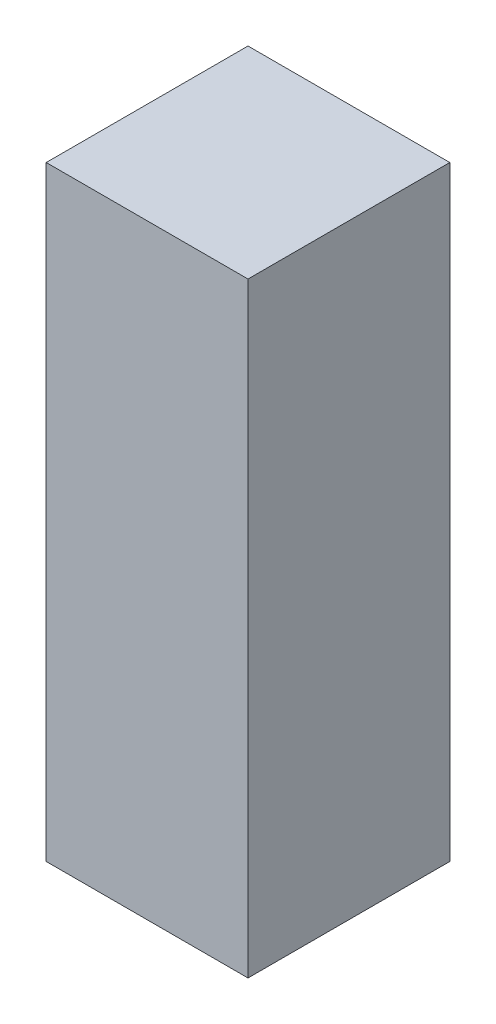
ISO-10303-21;
HEADER;
FILE_DESCRIPTION(('STEP AP214'),'2;1');
FILE_NAME('part.step','',(''),(''),'','','');
FILE_SCHEMA(('AUTOMOTIVE_DESIGN { 1 0 10303 214 1 1 1 1 }'));
ENDSEC;
DATA;
#1=APPLICATION_CONTEXT('core data for automotive mechanical design processes');
#2=APPLICATION_PROTOCOL_DEFINITION('international standard','automotive_design',2000,#1);
#3=PRODUCT_CONTEXT('',#1,'mechanical');
#4=PRODUCT('Part','Part','',(#3));
#5=PRODUCT_RELATED_PRODUCT_CATEGORY('part','',(#4));
#6=PRODUCT_DEFINITION_FORMATION('','',#4);
#7=PRODUCT_DEFINITION_CONTEXT('part definition',#1,'design');
#8=PRODUCT_DEFINITION('design','',#6,#7);
#9=PRODUCT_DEFINITION_SHAPE('','',#8);
#10=(LENGTH_UNIT() NAMED_UNIT(*) SI_UNIT(.MILLI.,.METRE.));
#11=(NAMED_UNIT(*) PLANE_ANGLE_UNIT() SI_UNIT($,.RADIAN.));
#12=(NAMED_UNIT(*) SI_UNIT($,.STERADIAN.) SOLID_ANGLE_UNIT());
#13=UNCERTAINTY_MEASURE_WITH_UNIT(LENGTH_MEASURE(1.E-05),#10,'distance_accuracy_value','');
#14=(GEOMETRIC_REPRESENTATION_CONTEXT(3) GLOBAL_UNCERTAINTY_ASSIGNED_CONTEXT((#13)) GLOBAL_UNIT_ASSIGNED_CONTEXT((#10,
#11,#12)) REPRESENTATION_CONTEXT('',''));
#15=CARTESIAN_POINT('',(0.,0.,0.));
#16=DIRECTION('',(0.,0.,1.));
#17=DIRECTION('',(1.,0.,0.));
#18=AXIS2_PLACEMENT_3D('',#15,#16,#17);
#19=CARTESIAN_POINT('',(0.,152.4,0.));
#20=DIRECTION('',(1.,0.,0.));
#21=DIRECTION('',(0.,0.,-1.));
#22=AXIS2_PLACEMENT_3D('',#19,#20,#21);
#23=PLANE('',#22);
#24=DIRECTION('',(0.,0.,1.));
#25=VECTOR('',#24,1.);
#26=CARTESIAN_POINT('',(0.,0.,0.));
#27=LINE('',#26,#25);
#28=CARTESIAN_POINT('',(0.,0.,-50.8));
#29=VERTEX_POINT('',#28);
#30=CARTESIAN_POINT('',(0.,0.,0.));
#31=VERTEX_POINT('',#30);
#32=EDGE_CURVE('E107',#29,#31,#27,.T.);
#33=ORIENTED_EDGE('',*,*,#32,.T.);
#34=DIRECTION('',(0.,-1.,0.));
#35=VECTOR('',#34,1.);
#36=CARTESIAN_POINT('',(0.,152.4,0.));
#37=LINE('',#36,#35);
#38=CARTESIAN_POINT('',(0.,152.4,0.));
#39=VERTEX_POINT('',#38);
#40=EDGE_CURVE('E11',#39,#31,#37,.T.);
#41=ORIENTED_EDGE('',*,*,#40,.F.);
#42=DIRECTION('',(0.,0.,1.));
#43=VECTOR('',#42,1.);
#44=CARTESIAN_POINT('',(0.,152.4,0.));
#45=LINE('',#44,#43);
#46=CARTESIAN_POINT('',(0.,152.4,-50.8));
#47=VERTEX_POINT('',#46);
#48=EDGE_CURVE('E91',#47,#39,#45,.T.);
#49=ORIENTED_EDGE('',*,*,#48,.F.);
#50=DIRECTION('',(0.,-1.,0.));
#51=VECTOR('',#50,1.);
#52=CARTESIAN_POINT('',(0.,152.4,-50.8));
#53=LINE('',#52,#51);
#54=EDGE_CURVE('E103',#47,#29,#53,.T.);
#55=ORIENTED_EDGE('',*,*,#54,.T.);
#56=EDGE_LOOP('',(#33,#41,#49,#55));
#57=FACE_BOUND('',#56,.T.);
#58=ADVANCED_FACE('F39',(#57),#23,.F.);
#59=CARTESIAN_POINT('',(0.,152.4,0.));
#60=DIRECTION('',(0.,0.,-1.));
#61=DIRECTION('',(-1.,0.,0.));
#62=AXIS2_PLACEMENT_3D('',#59,#60,#61);
#63=PLANE('',#62);
#64=DIRECTION('',(1.,0.,0.));
#65=VECTOR('',#64,1.);
#66=CARTESIAN_POINT('',(0.,0.,0.));
#67=LINE('',#66,#65);
#68=CARTESIAN_POINT('',(50.8,0.,0.));
#69=VERTEX_POINT('',#68);
#70=EDGE_CURVE('E96',#31,#69,#67,.T.);
#71=ORIENTED_EDGE('',*,*,#70,.T.);
#72=DIRECTION('',(0.,-1.,0.));
#73=VECTOR('',#72,1.);
#74=CARTESIAN_POINT('',(50.8,152.4,0.));
#75=LINE('',#74,#73);
#76=CARTESIAN_POINT('',(50.8,152.4,0.));
#77=VERTEX_POINT('',#76);
#78=EDGE_CURVE('E48',#77,#69,#75,.T.);
#79=ORIENTED_EDGE('',*,*,#78,.F.);
#80=DIRECTION('',(1.,0.,0.));
#81=VECTOR('',#80,1.);
#82=CARTESIAN_POINT('',(0.,152.4,0.));
#83=LINE('',#82,#81);
#84=EDGE_CURVE('E86',#39,#77,#83,.T.);
#85=ORIENTED_EDGE('',*,*,#84,.F.);
#86=ORIENTED_EDGE('',*,*,#40,.T.);
#87=EDGE_LOOP('',(#71,#79,#85,#86));
#88=FACE_BOUND('',#87,.T.);
#89=ADVANCED_FACE('F95',(#88),#63,.F.);
#90=CARTESIAN_POINT('',(50.8,152.4,0.));
#91=DIRECTION('',(-1.,0.,0.));
#92=DIRECTION('',(0.,0.,1.));
#93=AXIS2_PLACEMENT_3D('',#90,#91,#92);
#94=PLANE('',#93);
#95=DIRECTION('',(0.,0.,-1.));
#96=VECTOR('',#95,1.);
#97=CARTESIAN_POINT('',(50.8,0.,0.));
#98=LINE('',#97,#96);
#99=CARTESIAN_POINT('',(50.8,0.,-50.8));
#100=VERTEX_POINT('',#99);
#101=EDGE_CURVE('E73',#69,#100,#98,.T.);
#102=ORIENTED_EDGE('',*,*,#101,.T.);
#103=DIRECTION('',(0.,-1.,0.));
#104=VECTOR('',#103,1.);
#105=CARTESIAN_POINT('',(50.8,152.4,-50.8));
#106=LINE('',#105,#104);
#107=CARTESIAN_POINT('',(50.8,152.4,-50.8));
#108=VERTEX_POINT('',#107);
#109=EDGE_CURVE('E98',#108,#100,#106,.T.);
#110=ORIENTED_EDGE('',*,*,#109,.F.);
#111=DIRECTION('',(0.,0.,-1.));
#112=VECTOR('',#111,1.);
#113=CARTESIAN_POINT('',(50.8,152.4,0.));
#114=LINE('',#113,#112);
#115=EDGE_CURVE('E89',#77,#108,#114,.T.);
#116=ORIENTED_EDGE('',*,*,#115,.F.);
#117=ORIENTED_EDGE('',*,*,#78,.T.);
#118=EDGE_LOOP('',(#102,#110,#116,#117));
#119=FACE_BOUND('',#118,.T.);
#120=ADVANCED_FACE('F99',(#119),#94,.F.);
#121=CARTESIAN_POINT('',(0.,152.4,-50.8));
#122=DIRECTION('',(0.,0.,1.));
#123=DIRECTION('',(1.,0.,0.));
#124=AXIS2_PLACEMENT_3D('',#121,#122,#123);
#125=PLANE('',#124);
#126=DIRECTION('',(-1.,0.,0.));
#127=VECTOR('',#126,1.);
#128=CARTESIAN_POINT('',(0.,0.,-50.8));
#129=LINE('',#128,#127);
#130=EDGE_CURVE('E79',#100,#29,#129,.T.);
#131=ORIENTED_EDGE('',*,*,#130,.T.);
#132=ORIENTED_EDGE('',*,*,#54,.F.);
#133=DIRECTION('',(-1.,0.,0.));
#134=VECTOR('',#133,1.);
#135=CARTESIAN_POINT('',(0.,152.4,-50.8));
#136=LINE('',#135,#134);
#137=EDGE_CURVE('E56',#108,#47,#136,.T.);
#138=ORIENTED_EDGE('',*,*,#137,.F.);
#139=ORIENTED_EDGE('',*,*,#109,.T.);
#140=EDGE_LOOP('',(#131,#132,#138,#139));
#141=FACE_BOUND('',#140,.T.);
#142=ADVANCED_FACE('F120',(#141),#125,.F.);
#143=CARTESIAN_POINT('',(0.,152.4,0.));
#144=DIRECTION('',(0.,-1.,0.));
#145=DIRECTION('',(0.,0.,-1.));
#146=AXIS2_PLACEMENT_3D('',#143,#144,#145);
#147=PLANE('',#146);
#148=ORIENTED_EDGE('',*,*,#48,.T.);
#149=ORIENTED_EDGE('',*,*,#84,.T.);
#150=ORIENTED_EDGE('',*,*,#115,.T.);
#151=ORIENTED_EDGE('',*,*,#137,.T.);
#152=EDGE_LOOP('',(#148,#149,#150,#151));
#153=FACE_BOUND('',#152,.T.);
#154=ADVANCED_FACE('F87',(#153),#147,.F.);
#155=CARTESIAN_POINT('',(0.,0.,0.));
#156=DIRECTION('',(0.,-1.,0.));
#157=DIRECTION('',(0.,0.,-1.));
#158=AXIS2_PLACEMENT_3D('',#155,#156,#157);
#159=PLANE('',#158);
#160=ORIENTED_EDGE('',*,*,#32,.F.);
#161=ORIENTED_EDGE('',*,*,#130,.F.);
#162=ORIENTED_EDGE('',*,*,#101,.F.);
#163=ORIENTED_EDGE('',*,*,#70,.F.);
#164=EDGE_LOOP('',(#160,#161,#162,#163));
#165=FACE_BOUND('',#164,.T.);
#166=ADVANCED_FACE('F123',(#165),#159,.T.);
#167=CLOSED_SHELL('',(#58,#89,#120,#142,#154,#166));
#168=MANIFOLD_SOLID_BREP('B2',#167);
#169=ADVANCED_BREP_SHAPE_REPRESENTATION('',(#18,#168),#14);
#170=SHAPE_DEFINITION_REPRESENTATION(#9,#169);
ENDSEC;
END-ISO-10303-21;
